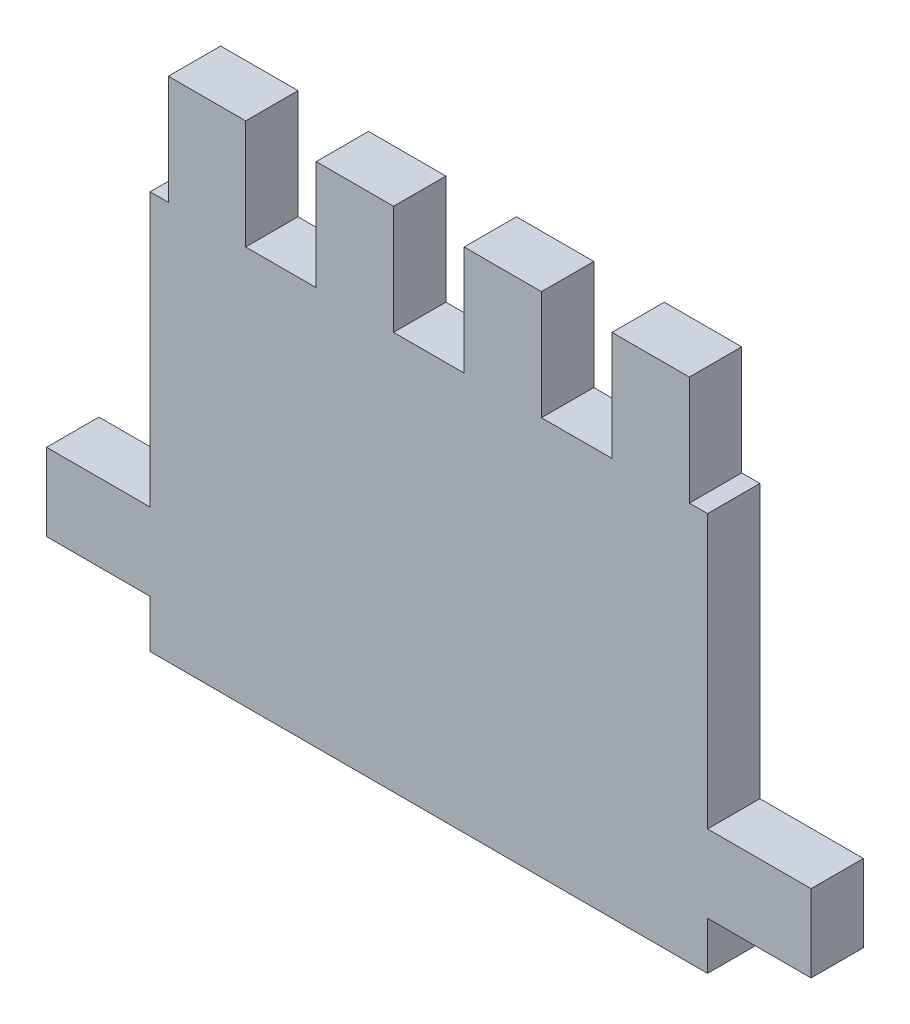
ISO-10303-21;
HEADER;
FILE_DESCRIPTION(('STEP AP214'),'2;1');
FILE_NAME('part.step','',(''),(''),'','','');
FILE_SCHEMA(('AUTOMOTIVE_DESIGN { 1 0 10303 214 1 1 1 1 }'));
ENDSEC;
DATA;
#1=APPLICATION_CONTEXT('core data for automotive mechanical design processes');
#2=APPLICATION_PROTOCOL_DEFINITION('international standard','automotive_design',2000,#1);
#3=PRODUCT_CONTEXT('',#1,'mechanical');
#4=PRODUCT('Part','Part','',(#3));
#5=PRODUCT_RELATED_PRODUCT_CATEGORY('part','',(#4));
#6=PRODUCT_DEFINITION_FORMATION('','',#4);
#7=PRODUCT_DEFINITION_CONTEXT('part definition',#1,'design');
#8=PRODUCT_DEFINITION('design','',#6,#7);
#9=PRODUCT_DEFINITION_SHAPE('','',#8);
#10=(LENGTH_UNIT() NAMED_UNIT(*) SI_UNIT(.MILLI.,.METRE.));
#11=(NAMED_UNIT(*) PLANE_ANGLE_UNIT() SI_UNIT($,.RADIAN.));
#12=(NAMED_UNIT(*) SI_UNIT($,.STERADIAN.) SOLID_ANGLE_UNIT());
#13=UNCERTAINTY_MEASURE_WITH_UNIT(LENGTH_MEASURE(1.E-05),#10,'distance_accuracy_value','');
#14=(GEOMETRIC_REPRESENTATION_CONTEXT(3) GLOBAL_UNCERTAINTY_ASSIGNED_CONTEXT((#13)) GLOBAL_UNIT_ASSIGNED_CONTEXT((#10,
#11,#12)) REPRESENTATION_CONTEXT('',''));
#15=CARTESIAN_POINT('',(0.,0.,0.));
#16=DIRECTION('',(0.,0.,1.));
#17=DIRECTION('',(1.,0.,0.));
#18=AXIS2_PLACEMENT_3D('',#15,#16,#17);
#19=CARTESIAN_POINT('',(47.6788,16.3949,1.93));
#20=DIRECTION('',(1.,0.,0.));
#21=DIRECTION('',(0.,1.,0.));
#22=AXIS2_PLACEMENT_3D('',#19,#20,#21);
#23=PLANE('',#22);
#24=DIRECTION('',(0.,0.,1.));
#25=VECTOR('',#24,1.);
#26=CARTESIAN_POINT('',(47.67880000001,16.05490000001,1.70000000001));
#27=LINE('',#26,#25);
#28=CARTESIAN_POINT('',(47.6788,16.0549,1.7));
#29=VERTEX_POINT('',#28);
#30=CARTESIAN_POINT('',(47.6788,16.0549,1.93));
#31=VERTEX_POINT('',#30);
#32=EDGE_CURVE('E11',#29,#31,#27,.T.);
#33=ORIENTED_EDGE('',*,*,#32,.T.);
#34=DIRECTION('',(0.,1.,0.));
#35=VECTOR('',#34,1.);
#36=CARTESIAN_POINT('',(47.67880000001,16.05490000001,1.93000000001));
#37=LINE('',#36,#35);
#38=CARTESIAN_POINT('',(47.6788,16.3949,1.93));
#39=VERTEX_POINT('',#38);
#40=EDGE_CURVE('E324',#31,#39,#37,.T.);
#41=ORIENTED_EDGE('',*,*,#40,.T.);
#42=DIRECTION('',(0.,0.,1.));
#43=VECTOR('',#42,1.);
#44=CARTESIAN_POINT('',(47.67880000001,16.39490000001,1.70000000001));
#45=LINE('',#44,#43);
#46=CARTESIAN_POINT('',(47.6788,16.3949,1.7));
#47=VERTEX_POINT('',#46);
#48=EDGE_CURVE('E379',#47,#39,#45,.T.);
#49=ORIENTED_EDGE('',*,*,#48,.F.);
#50=DIRECTION('',(0.,1.,0.));
#51=VECTOR('',#50,1.);
#52=CARTESIAN_POINT('',(47.67880000001,16.05490000001,1.70000000001));
#53=LINE('',#52,#51);
#54=EDGE_CURVE('E371',#29,#47,#53,.T.);
#55=ORIENTED_EDGE('',*,*,#54,.F.);
#56=EDGE_LOOP('',(#33,#41,#49,#55));
#57=FACE_BOUND('',#56,.T.);
#58=ADVANCED_FACE('F17',(#57),#23,.F.);
#59=CARTESIAN_POINT('',(48.1338,16.0549,1.93));
#60=DIRECTION('',(0.,1.,0.));
#61=DIRECTION('',(1.,0.,0.));
#62=AXIS2_PLACEMENT_3D('',#59,#60,#61);
#63=PLANE('',#62);
#64=DIRECTION('',(0.,0.,1.));
#65=VECTOR('',#64,1.);
#66=CARTESIAN_POINT('',(48.13380000001,16.05490000001,1.70000000001));
#67=LINE('',#66,#65);
#68=CARTESIAN_POINT('',(48.1338,16.0549,1.7));
#69=VERTEX_POINT('',#68);
#70=CARTESIAN_POINT('',(48.1338,16.0549,1.93));
#71=VERTEX_POINT('',#70);
#72=EDGE_CURVE('E21',#69,#71,#67,.T.);
#73=ORIENTED_EDGE('',*,*,#72,.T.);
#74=DIRECTION('',(-1.,0.,0.));
#75=VECTOR('',#74,1.);
#76=CARTESIAN_POINT('',(48.13380000001,16.05490000001,1.93000000001));
#77=LINE('',#76,#75);
#78=EDGE_CURVE('E327',#71,#31,#77,.T.);
#79=ORIENTED_EDGE('',*,*,#78,.T.);
#80=ORIENTED_EDGE('',*,*,#32,.F.);
#81=DIRECTION('',(-1.,0.,0.));
#82=VECTOR('',#81,1.);
#83=CARTESIAN_POINT('',(48.13380000001,16.05490000001,1.70000000001));
#84=LINE('',#83,#82);
#85=EDGE_CURVE('E376',#69,#29,#84,.T.);
#86=ORIENTED_EDGE('',*,*,#85,.F.);
#87=EDGE_LOOP('',(#73,#79,#80,#86));
#88=FACE_BOUND('',#87,.T.);
#89=ADVANCED_FACE('F485',(#88),#63,.F.);
#90=CARTESIAN_POINT('',(48.1338,16.0549,1.93));
#91=DIRECTION('',(1.,0.,0.));
#92=DIRECTION('',(0.,1.,0.));
#93=AXIS2_PLACEMENT_3D('',#90,#91,#92);
#94=PLANE('',#93);
#95=DIRECTION('',(0.,0.,1.));
#96=VECTOR('',#95,1.);
#97=CARTESIAN_POINT('',(48.13380000001,15.84490000001,1.70000000001));
#98=LINE('',#97,#96);
#99=CARTESIAN_POINT('',(48.1338,15.8449,1.7));
#100=VERTEX_POINT('',#99);
#101=CARTESIAN_POINT('',(48.1338,15.8449,1.93));
#102=VERTEX_POINT('',#101);
#103=EDGE_CURVE('E317',#100,#102,#98,.T.);
#104=ORIENTED_EDGE('',*,*,#103,.T.);
#105=DIRECTION('',(0.,1.,0.));
#106=VECTOR('',#105,1.);
#107=CARTESIAN_POINT('',(48.13380000001,15.84490000001,1.93000000001));
#108=LINE('',#107,#106);
#109=EDGE_CURVE('E389',#102,#71,#108,.T.);
#110=ORIENTED_EDGE('',*,*,#109,.T.);
#111=ORIENTED_EDGE('',*,*,#72,.F.);
#112=DIRECTION('',(0.,1.,0.));
#113=VECTOR('',#112,1.);
#114=CARTESIAN_POINT('',(48.13380000001,15.84490000001,1.70000000001));
#115=LINE('',#114,#113);
#116=EDGE_CURVE('E370',#100,#69,#115,.T.);
#117=ORIENTED_EDGE('',*,*,#116,.F.);
#118=EDGE_LOOP('',(#104,#110,#111,#117));
#119=FACE_BOUND('',#118,.T.);
#120=ADVANCED_FACE('F19',(#119),#94,.F.);
#121=CARTESIAN_POINT('',(50.5838,15.8449,1.93));
#122=DIRECTION('',(0.,1.,0.));
#123=DIRECTION('',(1.,0.,0.));
#124=AXIS2_PLACEMENT_3D('',#121,#122,#123);
#125=PLANE('',#124);
#126=DIRECTION('',(0.,0.,1.));
#127=VECTOR('',#126,1.);
#128=CARTESIAN_POINT('',(50.58380000001,15.84490000001,1.70000000001));
#129=LINE('',#128,#127);
#130=CARTESIAN_POINT('',(50.5838,15.8449,1.7));
#131=VERTEX_POINT('',#130);
#132=CARTESIAN_POINT('',(50.5838,15.8449,1.93));
#133=VERTEX_POINT('',#132);
#134=EDGE_CURVE('E314',#131,#133,#129,.T.);
#135=ORIENTED_EDGE('',*,*,#134,.T.);
#136=DIRECTION('',(-1.,0.,0.));
#137=VECTOR('',#136,1.);
#138=CARTESIAN_POINT('',(50.58380000001,15.84490000001,1.93000000001));
#139=LINE('',#138,#137);
#140=EDGE_CURVE('E345',#133,#102,#139,.T.);
#141=ORIENTED_EDGE('',*,*,#140,.T.);
#142=ORIENTED_EDGE('',*,*,#103,.F.);
#143=DIRECTION('',(-1.,0.,0.));
#144=VECTOR('',#143,1.);
#145=CARTESIAN_POINT('',(50.58380000001,15.84490000001,1.70000000001));
#146=LINE('',#145,#144);
#147=EDGE_CURVE('E361',#131,#100,#146,.T.);
#148=ORIENTED_EDGE('',*,*,#147,.F.);
#149=EDGE_LOOP('',(#135,#141,#142,#148));
#150=FACE_BOUND('',#149,.T.);
#151=ADVANCED_FACE('F1167',(#150),#125,.F.);
#152=CARTESIAN_POINT('',(50.5838,16.0549,1.93));
#153=DIRECTION('',(-1.,0.,0.));
#154=DIRECTION('',(0.,0.,1.));
#155=AXIS2_PLACEMENT_3D('',#152,#153,#154);
#156=PLANE('',#155);
#157=DIRECTION('',(0.,0.,1.));
#158=VECTOR('',#157,1.);
#159=CARTESIAN_POINT('',(50.58380000001,16.05490000001,1.70000000001));
#160=LINE('',#159,#158);
#161=CARTESIAN_POINT('',(50.5838,16.0549,1.7));
#162=VERTEX_POINT('',#161);
#163=CARTESIAN_POINT('',(50.5838,16.0549,1.93));
#164=VERTEX_POINT('',#163);
#165=EDGE_CURVE('E318',#162,#164,#160,.T.);
#166=ORIENTED_EDGE('',*,*,#165,.T.);
#167=DIRECTION('',(0.,-1.,0.));
#168=VECTOR('',#167,1.);
#169=CARTESIAN_POINT('',(50.58380000001,16.05490000001,1.93000000001));
#170=LINE('',#169,#168);
#171=EDGE_CURVE('E340',#164,#133,#170,.T.);
#172=ORIENTED_EDGE('',*,*,#171,.T.);
#173=ORIENTED_EDGE('',*,*,#134,.F.);
#174=DIRECTION('',(0.,-1.,0.));
#175=VECTOR('',#174,1.);
#176=CARTESIAN_POINT('',(50.58380000001,16.05490000001,1.70000000001));
#177=LINE('',#176,#175);
#178=EDGE_CURVE('E357',#162,#131,#177,.T.);
#179=ORIENTED_EDGE('',*,*,#178,.F.);
#180=EDGE_LOOP('',(#166,#172,#173,#179));
#181=FACE_BOUND('',#180,.T.);
#182=ADVANCED_FACE('F724',(#181),#156,.F.);
#183=CARTESIAN_POINT('',(50.5838,16.0549,1.93));
#184=DIRECTION('',(0.,1.,0.));
#185=DIRECTION('',(1.,0.,0.));
#186=AXIS2_PLACEMENT_3D('',#183,#184,#185);
#187=PLANE('',#186);
#188=DIRECTION('',(0.,0.,1.));
#189=VECTOR('',#188,1.);
#190=CARTESIAN_POINT('',(51.03880000001,16.05490000001,1.70000000001));
#191=LINE('',#190,#189);
#192=CARTESIAN_POINT('',(51.0388,16.0549,1.7));
#193=VERTEX_POINT('',#192);
#194=CARTESIAN_POINT('',(51.0388,16.0549,1.93));
#195=VERTEX_POINT('',#194);
#196=EDGE_CURVE('E332',#193,#195,#191,.T.);
#197=ORIENTED_EDGE('',*,*,#196,.T.);
#198=DIRECTION('',(-1.,0.,0.));
#199=VECTOR('',#198,1.);
#200=CARTESIAN_POINT('',(51.03880000001,16.05490000001,1.93000000001));
#201=LINE('',#200,#199);
#202=EDGE_CURVE('E344',#195,#164,#201,.T.);
#203=ORIENTED_EDGE('',*,*,#202,.T.);
#204=ORIENTED_EDGE('',*,*,#165,.F.);
#205=DIRECTION('',(-1.,0.,0.));
#206=VECTOR('',#205,1.);
#207=CARTESIAN_POINT('',(51.03880000001,16.05490000001,1.70000000001));
#208=LINE('',#207,#206);
#209=EDGE_CURVE('E353',#193,#162,#208,.T.);
#210=ORIENTED_EDGE('',*,*,#209,.F.);
#211=EDGE_LOOP('',(#197,#203,#204,#210));
#212=FACE_BOUND('',#211,.T.);
#213=ADVANCED_FACE('F715',(#212),#187,.F.);
#214=CARTESIAN_POINT('',(51.0388,16.3949,1.93));
#215=DIRECTION('',(-1.,0.,0.));
#216=DIRECTION('',(0.,0.,1.));
#217=AXIS2_PLACEMENT_3D('',#214,#215,#216);
#218=PLANE('',#217);
#219=DIRECTION('',(0.,0.,1.));
#220=VECTOR('',#219,1.);
#221=CARTESIAN_POINT('',(51.03880000001,16.39490000001,1.70000000001));
#222=LINE('',#221,#220);
#223=CARTESIAN_POINT('',(51.0388,16.3949,1.7));
#224=VERTEX_POINT('',#223);
#225=CARTESIAN_POINT('',(51.0388,16.3949,1.93));
#226=VERTEX_POINT('',#225);
#227=EDGE_CURVE('E335',#224,#226,#222,.T.);
#228=ORIENTED_EDGE('',*,*,#227,.T.);
#229=DIRECTION('',(0.,-1.,0.));
#230=VECTOR('',#229,1.);
#231=CARTESIAN_POINT('',(51.03880000001,16.39490000001,1.93000000001));
#232=LINE('',#231,#230);
#233=EDGE_CURVE('E396',#226,#195,#232,.T.);
#234=ORIENTED_EDGE('',*,*,#233,.T.);
#235=ORIENTED_EDGE('',*,*,#196,.F.);
#236=DIRECTION('',(0.,-1.,0.));
#237=VECTOR('',#236,1.);
#238=CARTESIAN_POINT('',(51.03880000001,16.39490000001,1.70000000001));
#239=LINE('',#238,#237);
#240=EDGE_CURVE('E349',#224,#193,#239,.T.);
#241=ORIENTED_EDGE('',*,*,#240,.F.);
#242=EDGE_LOOP('',(#228,#234,#235,#241));
#243=FACE_BOUND('',#242,.T.);
#244=ADVANCED_FACE('F712',(#243),#218,.F.);
#245=CARTESIAN_POINT('',(50.5838,16.3949,1.93));
#246=DIRECTION('',(0.,-1.,0.));
#247=DIRECTION('',(0.,0.,-1.));
#248=AXIS2_PLACEMENT_3D('',#245,#246,#247);
#249=PLANE('',#248);
#250=DIRECTION('',(0.,0.,1.));
#251=VECTOR('',#250,1.);
#252=CARTESIAN_POINT('',(50.58380000001,16.39490000001,1.70000000001));
#253=LINE('',#252,#251);
#254=CARTESIAN_POINT('',(50.5838,16.3949,1.7));
#255=VERTEX_POINT('',#254);
#256=CARTESIAN_POINT('',(50.5838,16.3949,1.93));
#257=VERTEX_POINT('',#256);
#258=EDGE_CURVE('E385',#255,#257,#253,.T.);
#259=ORIENTED_EDGE('',*,*,#258,.T.);
#260=DIRECTION('',(1.,0.,0.));
#261=VECTOR('',#260,1.);
#262=CARTESIAN_POINT('',(50.58380000001,16.39490000001,1.93000000001));
#263=LINE('',#262,#261);
#264=EDGE_CURVE('E397',#257,#226,#263,.T.);
#265=ORIENTED_EDGE('',*,*,#264,.T.);
#266=ORIENTED_EDGE('',*,*,#227,.F.);
#267=DIRECTION('',(1.,0.,0.));
#268=VECTOR('',#267,1.);
#269=CARTESIAN_POINT('',(50.58380000001,16.39490000001,1.70000000001));
#270=LINE('',#269,#268);
#271=EDGE_CURVE('E339',#255,#224,#270,.T.);
#272=ORIENTED_EDGE('',*,*,#271,.F.);
#273=EDGE_LOOP('',(#259,#265,#266,#272));
#274=FACE_BOUND('',#273,.T.);
#275=ADVANCED_FACE('F714',(#274),#249,.F.);
#276=CARTESIAN_POINT('',(50.5838,17.5949,1.93));
#277=DIRECTION('',(-1.,0.,0.));
#278=DIRECTION('',(0.,0.,1.));
#279=AXIS2_PLACEMENT_3D('',#276,#277,#278);
#280=PLANE('',#279);
#281=DIRECTION('',(0.,0.,1.));
#282=VECTOR('',#281,1.);
#283=CARTESIAN_POINT('',(50.58380000001,17.59490000001,1.70000000001));
#284=LINE('',#283,#282);
#285=CARTESIAN_POINT('',(50.5838,17.5949,1.7));
#286=VERTEX_POINT('',#285);
#287=CARTESIAN_POINT('',(50.5838,17.5949,1.93));
#288=VERTEX_POINT('',#287);
#289=EDGE_CURVE('E472',#286,#288,#284,.T.);
#290=ORIENTED_EDGE('',*,*,#289,.T.);
#291=DIRECTION('',(0.,-1.,0.));
#292=VECTOR('',#291,1.);
#293=CARTESIAN_POINT('',(50.58380000001,17.59490000001,1.93000000001));
#294=LINE('',#293,#292);
#295=EDGE_CURVE('E401',#288,#257,#294,.T.);
#296=ORIENTED_EDGE('',*,*,#295,.T.);
#297=ORIENTED_EDGE('',*,*,#258,.F.);
#298=DIRECTION('',(0.,-1.,0.));
#299=VECTOR('',#298,1.);
#300=CARTESIAN_POINT('',(50.58380000001,17.59490000001,1.70000000001));
#301=LINE('',#300,#299);
#302=EDGE_CURVE('E331',#286,#255,#301,.T.);
#303=ORIENTED_EDGE('',*,*,#302,.F.);
#304=EDGE_LOOP('',(#290,#296,#297,#303));
#305=FACE_BOUND('',#304,.T.);
#306=ADVANCED_FACE('F707',(#305),#280,.F.);
#307=CARTESIAN_POINT('',(50.5038,17.5949,1.93));
#308=DIRECTION('',(0.,-1.,0.));
#309=DIRECTION('',(0.,0.,-1.));
#310=AXIS2_PLACEMENT_3D('',#307,#308,#309);
#311=PLANE('',#310);
#312=DIRECTION('',(0.,0.,1.));
#313=VECTOR('',#312,1.);
#314=CARTESIAN_POINT('',(50.50380000001,17.59490000001,1.70000000001));
#315=LINE('',#314,#313);
#316=CARTESIAN_POINT('',(50.5038,17.5949,1.7));
#317=VERTEX_POINT('',#316);
#318=CARTESIAN_POINT('',(50.5038,17.5949,1.93));
#319=VERTEX_POINT('',#318);
#320=EDGE_CURVE('E288',#317,#319,#315,.T.);
#321=ORIENTED_EDGE('',*,*,#320,.T.);
#322=DIRECTION('',(1.,0.,0.));
#323=VECTOR('',#322,1.);
#324=CARTESIAN_POINT('',(50.50380000001,17.59490000001,1.93000000001));
#325=LINE('',#324,#323);
#326=EDGE_CURVE('E405',#319,#288,#325,.T.);
#327=ORIENTED_EDGE('',*,*,#326,.T.);
#328=ORIENTED_EDGE('',*,*,#289,.F.);
#329=DIRECTION('',(1.,0.,0.));
#330=VECTOR('',#329,1.);
#331=CARTESIAN_POINT('',(50.50380000001,17.59490000001,1.70000000001));
#332=LINE('',#331,#330);
#333=EDGE_CURVE('E297',#317,#286,#332,.T.);
#334=ORIENTED_EDGE('',*,*,#333,.F.);
#335=EDGE_LOOP('',(#321,#327,#328,#334));
#336=FACE_BOUND('',#335,.T.);
#337=ADVANCED_FACE('F704',(#336),#311,.F.);
#338=CARTESIAN_POINT('',(50.5038,17.5949,1.93));
#339=DIRECTION('',(-1.,0.,0.));
#340=DIRECTION('',(0.,0.,1.));
#341=AXIS2_PLACEMENT_3D('',#338,#339,#340);
#342=PLANE('',#341);
#343=DIRECTION('',(0.,0.,1.));
#344=VECTOR('',#343,1.);
#345=CARTESIAN_POINT('',(50.50380000001,18.07490000001,1.70000000001));
#346=LINE('',#345,#344);
#347=CARTESIAN_POINT('',(50.5038,18.0749,1.7));
#348=VERTEX_POINT('',#347);
#349=CARTESIAN_POINT('',(50.5038,18.0749,1.93));
#350=VERTEX_POINT('',#349);
#351=EDGE_CURVE('E276',#348,#350,#346,.T.);
#352=ORIENTED_EDGE('',*,*,#351,.T.);
#353=DIRECTION('',(0.,-1.,0.));
#354=VECTOR('',#353,1.);
#355=CARTESIAN_POINT('',(50.50380000001,18.07490000001,1.93000000001));
#356=LINE('',#355,#354);
#357=EDGE_CURVE('E409',#350,#319,#356,.T.);
#358=ORIENTED_EDGE('',*,*,#357,.T.);
#359=ORIENTED_EDGE('',*,*,#320,.F.);
#360=DIRECTION('',(0.,-1.,0.));
#361=VECTOR('',#360,1.);
#362=CARTESIAN_POINT('',(50.50380000001,18.07490000001,1.70000000001));
#363=LINE('',#362,#361);
#364=EDGE_CURVE('E291',#348,#317,#363,.T.);
#365=ORIENTED_EDGE('',*,*,#364,.F.);
#366=EDGE_LOOP('',(#352,#358,#359,#365));
#367=FACE_BOUND('',#366,.T.);
#368=ADVANCED_FACE('F292',(#367),#342,.F.);
#369=CARTESIAN_POINT('',(50.1638,18.0749,1.93));
#370=DIRECTION('',(0.,-1.,0.));
#371=DIRECTION('',(0.,0.,-1.));
#372=AXIS2_PLACEMENT_3D('',#369,#370,#371);
#373=PLANE('',#372);
#374=DIRECTION('',(0.,0.,1.));
#375=VECTOR('',#374,1.);
#376=CARTESIAN_POINT('',(50.16380000001,18.07490000001,1.70000000001));
#377=LINE('',#376,#375);
#378=CARTESIAN_POINT('',(50.1638,18.0749,1.7));
#379=VERTEX_POINT('',#378);
#380=CARTESIAN_POINT('',(50.1638,18.0749,1.93));
#381=VERTEX_POINT('',#380);
#382=EDGE_CURVE('E270',#379,#381,#377,.T.);
#383=ORIENTED_EDGE('',*,*,#382,.T.);
#384=DIRECTION('',(1.,0.,0.));
#385=VECTOR('',#384,1.);
#386=CARTESIAN_POINT('',(50.16380000001,18.07490000001,1.93000000001));
#387=LINE('',#386,#385);
#388=EDGE_CURVE('E283',#381,#350,#387,.T.);
#389=ORIENTED_EDGE('',*,*,#388,.T.);
#390=ORIENTED_EDGE('',*,*,#351,.F.);
#391=DIRECTION('',(1.,0.,0.));
#392=VECTOR('',#391,1.);
#393=CARTESIAN_POINT('',(50.16380000001,18.07490000001,1.70000000001));
#394=LINE('',#393,#392);
#395=EDGE_CURVE('E280',#379,#348,#394,.T.);
#396=ORIENTED_EDGE('',*,*,#395,.F.);
#397=EDGE_LOOP('',(#383,#389,#390,#396));
#398=FACE_BOUND('',#397,.T.);
#399=ADVANCED_FACE('F278',(#398),#373,.F.);
#400=CARTESIAN_POINT('',(50.1638,17.5949,1.93));
#401=DIRECTION('',(1.,0.,0.));
#402=DIRECTION('',(0.,1.,0.));
#403=AXIS2_PLACEMENT_3D('',#400,#401,#402);
#404=PLANE('',#403);
#405=DIRECTION('',(0.,0.,1.));
#406=VECTOR('',#405,1.);
#407=CARTESIAN_POINT('',(50.16380000001,17.59490000001,1.70000000001));
#408=LINE('',#407,#406);
#409=CARTESIAN_POINT('',(50.1638,17.5949,1.7));
#410=VERTEX_POINT('',#409);
#411=CARTESIAN_POINT('',(50.1638,17.5949,1.93));
#412=VERTEX_POINT('',#411);
#413=EDGE_CURVE('E468',#410,#412,#408,.T.);
#414=ORIENTED_EDGE('',*,*,#413,.T.);
#415=DIRECTION('',(0.,1.,0.));
#416=VECTOR('',#415,1.);
#417=CARTESIAN_POINT('',(50.16380000001,17.59490000001,1.93000000001));
#418=LINE('',#417,#416);
#419=EDGE_CURVE('E312',#412,#381,#418,.T.);
#420=ORIENTED_EDGE('',*,*,#419,.T.);
#421=ORIENTED_EDGE('',*,*,#382,.F.);
#422=DIRECTION('',(0.,1.,0.));
#423=VECTOR('',#422,1.);
#424=CARTESIAN_POINT('',(50.16380000001,17.59490000001,1.70000000001));
#425=LINE('',#424,#423);
#426=EDGE_CURVE('E302',#410,#379,#425,.T.);
#427=ORIENTED_EDGE('',*,*,#426,.F.);
#428=EDGE_LOOP('',(#414,#420,#421,#427));
#429=FACE_BOUND('',#428,.T.);
#430=ADVANCED_FACE('F673',(#429),#404,.F.);
#431=CARTESIAN_POINT('',(50.1638,17.5949,1.93));
#432=DIRECTION('',(0.,-1.,0.));
#433=DIRECTION('',(0.,0.,-1.));
#434=AXIS2_PLACEMENT_3D('',#431,#432,#433);
#435=PLANE('',#434);
#436=DIRECTION('',(0.,0.,1.));
#437=VECTOR('',#436,1.);
#438=CARTESIAN_POINT('',(49.85380000001,17.59490000001,1.70000000001));
#439=LINE('',#438,#437);
#440=CARTESIAN_POINT('',(49.8538,17.5949,1.7));
#441=VERTEX_POINT('',#440);
#442=CARTESIAN_POINT('',(49.8538,17.5949,1.93));
#443=VERTEX_POINT('',#442);
#444=EDGE_CURVE('E466',#441,#443,#439,.T.);
#445=ORIENTED_EDGE('',*,*,#444,.T.);
#446=DIRECTION('',(1.,0.,0.));
#447=VECTOR('',#446,1.);
#448=CARTESIAN_POINT('',(49.85380000001,17.59490000001,1.93000000001));
#449=LINE('',#448,#447);
#450=EDGE_CURVE('E319',#443,#412,#449,.T.);
#451=ORIENTED_EDGE('',*,*,#450,.T.);
#452=ORIENTED_EDGE('',*,*,#413,.F.);
#453=DIRECTION('',(1.,0.,0.));
#454=VECTOR('',#453,1.);
#455=CARTESIAN_POINT('',(49.85380000001,17.59490000001,1.70000000001));
#456=LINE('',#455,#454);
#457=EDGE_CURVE('E309',#441,#410,#456,.T.);
#458=ORIENTED_EDGE('',*,*,#457,.F.);
#459=EDGE_LOOP('',(#445,#451,#452,#458));
#460=FACE_BOUND('',#459,.T.);
#461=ADVANCED_FACE('F671',(#460),#435,.F.);
#462=CARTESIAN_POINT('',(49.8538,17.5949,1.93));
#463=DIRECTION('',(-1.,0.,0.));
#464=DIRECTION('',(0.,0.,1.));
#465=AXIS2_PLACEMENT_3D('',#462,#463,#464);
#466=PLANE('',#465);
#467=DIRECTION('',(0.,0.,1.));
#468=VECTOR('',#467,1.);
#469=CARTESIAN_POINT('',(49.85380000001,18.07490000001,1.70000000001));
#470=LINE('',#469,#468);
#471=CARTESIAN_POINT('',(49.8538,18.0749,1.7));
#472=VERTEX_POINT('',#471);
#473=CARTESIAN_POINT('',(49.8538,18.0749,1.93));
#474=VERTEX_POINT('',#473);
#475=EDGE_CURVE('E463',#472,#474,#470,.T.);
#476=ORIENTED_EDGE('',*,*,#475,.T.);
#477=DIRECTION('',(0.,-1.,0.));
#478=VECTOR('',#477,1.);
#479=CARTESIAN_POINT('',(49.85380000001,18.07490000001,1.93000000001));
#480=LINE('',#479,#478);
#481=EDGE_CURVE('E323',#474,#443,#480,.T.);
#482=ORIENTED_EDGE('',*,*,#481,.T.);
#483=ORIENTED_EDGE('',*,*,#444,.F.);
#484=DIRECTION('',(0.,-1.,0.));
#485=VECTOR('',#484,1.);
#486=CARTESIAN_POINT('',(49.85380000001,18.07490000001,1.70000000001));
#487=LINE('',#486,#485);
#488=EDGE_CURVE('E511',#472,#441,#487,.T.);
#489=ORIENTED_EDGE('',*,*,#488,.F.);
#490=EDGE_LOOP('',(#476,#482,#483,#489));
#491=FACE_BOUND('',#490,.T.);
#492=ADVANCED_FACE('F668',(#491),#466,.F.);
#493=CARTESIAN_POINT('',(49.5138,18.0749,1.93));
#494=DIRECTION('',(0.,-1.,0.));
#495=DIRECTION('',(0.,0.,-1.));
#496=AXIS2_PLACEMENT_3D('',#493,#494,#495);
#497=PLANE('',#496);
#498=DIRECTION('',(0.,0.,1.));
#499=VECTOR('',#498,1.);
#500=CARTESIAN_POINT('',(49.51380000001,18.07490000001,1.70000000001));
#501=LINE('',#500,#499);
#502=CARTESIAN_POINT('',(49.5138,18.0749,1.7));
#503=VERTEX_POINT('',#502);
#504=CARTESIAN_POINT('',(49.5138,18.0749,1.93));
#505=VERTEX_POINT('',#504);
#506=EDGE_CURVE('E462',#503,#505,#501,.T.);
#507=ORIENTED_EDGE('',*,*,#506,.T.);
#508=DIRECTION('',(1.,0.,0.));
#509=VECTOR('',#508,1.);
#510=CARTESIAN_POINT('',(49.51380000001,18.07490000001,1.93000000001));
#511=LINE('',#510,#509);
#512=EDGE_CURVE('E417',#505,#474,#511,.T.);
#513=ORIENTED_EDGE('',*,*,#512,.T.);
#514=ORIENTED_EDGE('',*,*,#475,.F.);
#515=DIRECTION('',(1.,0.,0.));
#516=VECTOR('',#515,1.);
#517=CARTESIAN_POINT('',(49.51380000001,18.07490000001,1.70000000001));
#518=LINE('',#517,#516);
#519=EDGE_CURVE('E517',#503,#472,#518,.T.);
#520=ORIENTED_EDGE('',*,*,#519,.F.);
#521=EDGE_LOOP('',(#507,#513,#514,#520));
#522=FACE_BOUND('',#521,.T.);
#523=ADVANCED_FACE('F665',(#522),#497,.F.);
#524=CARTESIAN_POINT('',(49.5138,17.5949,1.93));
#525=DIRECTION('',(1.,0.,0.));
#526=DIRECTION('',(0.,1.,0.));
#527=AXIS2_PLACEMENT_3D('',#524,#525,#526);
#528=PLANE('',#527);
#529=DIRECTION('',(0.,0.,1.));
#530=VECTOR('',#529,1.);
#531=CARTESIAN_POINT('',(49.51380000001,17.59490000001,1.70000000001));
#532=LINE('',#531,#530);
#533=CARTESIAN_POINT('',(49.5138,17.5949,1.7));
#534=VERTEX_POINT('',#533);
#535=CARTESIAN_POINT('',(49.5138,17.5949,1.93));
#536=VERTEX_POINT('',#535);
#537=EDGE_CURVE('E457',#534,#536,#532,.T.);
#538=ORIENTED_EDGE('',*,*,#537,.T.);
#539=DIRECTION('',(0.,1.,0.));
#540=VECTOR('',#539,1.);
#541=CARTESIAN_POINT('',(49.51380000001,17.59490000001,1.93000000001));
#542=LINE('',#541,#540);
#543=EDGE_CURVE('E418',#536,#505,#542,.T.);
#544=ORIENTED_EDGE('',*,*,#543,.T.);
#545=ORIENTED_EDGE('',*,*,#506,.F.);
#546=DIRECTION('',(0.,1.,0.));
#547=VECTOR('',#546,1.);
#548=CARTESIAN_POINT('',(49.51380000001,17.59490000001,1.70000000001));
#549=LINE('',#548,#547);
#550=EDGE_CURVE('E524',#534,#503,#549,.T.);
#551=ORIENTED_EDGE('',*,*,#550,.F.);
#552=EDGE_LOOP('',(#538,#544,#545,#551));
#553=FACE_BOUND('',#552,.T.);
#554=ADVANCED_FACE('F660',(#553),#528,.F.);
#555=CARTESIAN_POINT('',(49.5138,17.5949,1.93));
#556=DIRECTION('',(0.,-1.,0.));
#557=DIRECTION('',(0.,0.,-1.));
#558=AXIS2_PLACEMENT_3D('',#555,#556,#557);
#559=PLANE('',#558);
#560=DIRECTION('',(0.,0.,1.));
#561=VECTOR('',#560,1.);
#562=CARTESIAN_POINT('',(49.20380000001,17.59490000001,1.70000000001));
#563=LINE('',#562,#561);
#564=CARTESIAN_POINT('',(49.2038,17.5949,1.7));
#565=VERTEX_POINT('',#564);
#566=CARTESIAN_POINT('',(49.2038,17.5949,1.93));
#567=VERTEX_POINT('',#566);
#568=EDGE_CURVE('E454',#565,#567,#563,.T.);
#569=ORIENTED_EDGE('',*,*,#568,.T.);
#570=DIRECTION('',(1.,0.,0.));
#571=VECTOR('',#570,1.);
#572=CARTESIAN_POINT('',(49.20380000001,17.59490000001,1.93000000001));
#573=LINE('',#572,#571);
#574=EDGE_CURVE('E422',#567,#536,#573,.T.);
#575=ORIENTED_EDGE('',*,*,#574,.T.);
#576=ORIENTED_EDGE('',*,*,#537,.F.);
#577=DIRECTION('',(1.,0.,0.));
#578=VECTOR('',#577,1.);
#579=CARTESIAN_POINT('',(49.20380000001,17.59490000001,1.70000000001));
#580=LINE('',#579,#578);
#581=EDGE_CURVE('E551',#565,#534,#580,.T.);
#582=ORIENTED_EDGE('',*,*,#581,.F.);
#583=EDGE_LOOP('',(#569,#575,#576,#582));
#584=FACE_BOUND('',#583,.T.);
#585=ADVANCED_FACE('F657',(#584),#559,.F.);
#586=CARTESIAN_POINT('',(49.2038,17.5949,1.93));
#587=DIRECTION('',(-1.,0.,0.));
#588=DIRECTION('',(0.,0.,1.));
#589=AXIS2_PLACEMENT_3D('',#586,#587,#588);
#590=PLANE('',#589);
#591=DIRECTION('',(0.,0.,1.));
#592=VECTOR('',#591,1.);
#593=CARTESIAN_POINT('',(49.20380000001,18.07490000001,1.70000000001));
#594=LINE('',#593,#592);
#595=CARTESIAN_POINT('',(49.2038,18.0749,1.7));
#596=VERTEX_POINT('',#595);
#597=CARTESIAN_POINT('',(49.2038,18.0749,1.93));
#598=VERTEX_POINT('',#597);
#599=EDGE_CURVE('E453',#596,#598,#594,.T.);
#600=ORIENTED_EDGE('',*,*,#599,.T.);
#601=DIRECTION('',(0.,-1.,0.));
#602=VECTOR('',#601,1.);
#603=CARTESIAN_POINT('',(49.20380000001,18.07490000001,1.93000000001));
#604=LINE('',#603,#602);
#605=EDGE_CURVE('E426',#598,#567,#604,.T.);
#606=ORIENTED_EDGE('',*,*,#605,.T.);
#607=ORIENTED_EDGE('',*,*,#568,.F.);
#608=DIRECTION('',(0.,-1.,0.));
#609=VECTOR('',#608,1.);
#610=CARTESIAN_POINT('',(49.20380000001,18.07490000001,1.70000000001));
#611=LINE('',#610,#609);
#612=EDGE_CURVE('E547',#596,#565,#611,.T.);
#613=ORIENTED_EDGE('',*,*,#612,.F.);
#614=EDGE_LOOP('',(#600,#606,#607,#613));
#615=FACE_BOUND('',#614,.T.);
#616=ADVANCED_FACE('F654',(#615),#590,.F.);
#617=CARTESIAN_POINT('',(48.8638,18.0749,1.93));
#618=DIRECTION('',(0.,-1.,0.));
#619=DIRECTION('',(0.,0.,-1.));
#620=AXIS2_PLACEMENT_3D('',#617,#618,#619);
#621=PLANE('',#620);
#622=DIRECTION('',(0.,0.,1.));
#623=VECTOR('',#622,1.);
#624=CARTESIAN_POINT('',(48.86380000001,18.07490000001,1.70000000001));
#625=LINE('',#624,#623);
#626=CARTESIAN_POINT('',(48.8638,18.0749,1.7));
#627=VERTEX_POINT('',#626);
#628=CARTESIAN_POINT('',(48.8638,18.0749,1.93));
#629=VERTEX_POINT('',#628);
#630=EDGE_CURVE('E450',#627,#629,#625,.T.);
#631=ORIENTED_EDGE('',*,*,#630,.T.);
#632=DIRECTION('',(1.,0.,0.));
#633=VECTOR('',#632,1.);
#634=CARTESIAN_POINT('',(48.86380000001,18.07490000001,1.93000000001));
#635=LINE('',#634,#633);
#636=EDGE_CURVE('E427',#629,#598,#635,.T.);
#637=ORIENTED_EDGE('',*,*,#636,.T.);
#638=ORIENTED_EDGE('',*,*,#599,.F.);
#639=DIRECTION('',(1.,0.,0.));
#640=VECTOR('',#639,1.);
#641=CARTESIAN_POINT('',(48.86380000001,18.07490000001,1.70000000001));
#642=LINE('',#641,#640);
#643=EDGE_CURVE('E552',#627,#596,#642,.T.);
#644=ORIENTED_EDGE('',*,*,#643,.F.);
#645=EDGE_LOOP('',(#631,#637,#638,#644));
#646=FACE_BOUND('',#645,.T.);
#647=ADVANCED_FACE('F650',(#646),#621,.F.);
#648=CARTESIAN_POINT('',(48.8638,17.5949,1.93));
#649=DIRECTION('',(1.,0.,0.));
#650=DIRECTION('',(0.,1.,0.));
#651=AXIS2_PLACEMENT_3D('',#648,#649,#650);
#652=PLANE('',#651);
#653=DIRECTION('',(0.,0.,1.));
#654=VECTOR('',#653,1.);
#655=CARTESIAN_POINT('',(48.86380000001,17.59490000001,1.70000000001));
#656=LINE('',#655,#654);
#657=CARTESIAN_POINT('',(48.8638,17.5949,1.7));
#658=VERTEX_POINT('',#657);
#659=CARTESIAN_POINT('',(48.8638,17.5949,1.93));
#660=VERTEX_POINT('',#659);
#661=EDGE_CURVE('E447',#658,#660,#656,.T.);
#662=ORIENTED_EDGE('',*,*,#661,.T.);
#663=DIRECTION('',(0.,1.,0.));
#664=VECTOR('',#663,1.);
#665=CARTESIAN_POINT('',(48.86380000001,17.59490000001,1.93000000001));
#666=LINE('',#665,#664);
#667=EDGE_CURVE('E366',#660,#629,#666,.T.);
#668=ORIENTED_EDGE('',*,*,#667,.T.);
#669=ORIENTED_EDGE('',*,*,#630,.F.);
#670=DIRECTION('',(0.,1.,0.));
#671=VECTOR('',#670,1.);
#672=CARTESIAN_POINT('',(48.86380000001,17.59490000001,1.70000000001));
#673=LINE('',#672,#671);
#674=EDGE_CURVE('E545',#658,#627,#673,.T.);
#675=ORIENTED_EDGE('',*,*,#674,.F.);
#676=EDGE_LOOP('',(#662,#668,#669,#675));
#677=FACE_BOUND('',#676,.T.);
#678=ADVANCED_FACE('F647',(#677),#652,.F.);
#679=CARTESIAN_POINT('',(48.8638,17.5949,1.93));
#680=DIRECTION('',(0.,-1.,0.));
#681=DIRECTION('',(0.,0.,-1.));
#682=AXIS2_PLACEMENT_3D('',#679,#680,#681);
#683=PLANE('',#682);
#684=DIRECTION('',(0.,0.,1.));
#685=VECTOR('',#684,1.);
#686=CARTESIAN_POINT('',(48.55380000001,17.59490000001,1.70000000001));
#687=LINE('',#686,#685);
#688=CARTESIAN_POINT('',(48.5538,17.5949,1.7));
#689=VERTEX_POINT('',#688);
#690=CARTESIAN_POINT('',(48.5538,17.5949,1.93));
#691=VERTEX_POINT('',#690);
#692=EDGE_CURVE('E180',#689,#691,#687,.T.);
#693=ORIENTED_EDGE('',*,*,#692,.T.);
#694=DIRECTION('',(1.,0.,0.));
#695=VECTOR('',#694,1.);
#696=CARTESIAN_POINT('',(48.55380000001,17.59490000001,1.93000000001));
#697=LINE('',#696,#695);
#698=EDGE_CURVE('E362',#691,#660,#697,.T.);
#699=ORIENTED_EDGE('',*,*,#698,.T.);
#700=ORIENTED_EDGE('',*,*,#661,.F.);
#701=DIRECTION('',(1.,0.,0.));
#702=VECTOR('',#701,1.);
#703=CARTESIAN_POINT('',(48.55380000001,17.59490000001,1.70000000001));
#704=LINE('',#703,#702);
#705=EDGE_CURVE('E541',#689,#658,#704,.T.);
#706=ORIENTED_EDGE('',*,*,#705,.F.);
#707=EDGE_LOOP('',(#693,#699,#700,#706));
#708=FACE_BOUND('',#707,.T.);
#709=ADVANCED_FACE('F643',(#708),#683,.F.);
#710=CARTESIAN_POINT('',(48.5538,17.5949,1.93));
#711=DIRECTION('',(-1.,0.,0.));
#712=DIRECTION('',(0.,0.,1.));
#713=AXIS2_PLACEMENT_3D('',#710,#711,#712);
#714=PLANE('',#713);
#715=DIRECTION('',(0.,0.,1.));
#716=VECTOR('',#715,1.);
#717=CARTESIAN_POINT('',(48.55380000001,18.07490000001,1.70000000001));
#718=LINE('',#717,#716);
#719=CARTESIAN_POINT('',(48.5538,18.0749,1.7));
#720=VERTEX_POINT('',#719);
#721=CARTESIAN_POINT('',(48.5538,18.0749,1.93));
#722=VERTEX_POINT('',#721);
#723=EDGE_CURVE('E191',#720,#722,#718,.T.);
#724=ORIENTED_EDGE('',*,*,#723,.T.);
#725=DIRECTION('',(0.,-1.,0.));
#726=VECTOR('',#725,1.);
#727=CARTESIAN_POINT('',(48.55380000001,18.07490000001,1.93000000001));
#728=LINE('',#727,#726);
#729=EDGE_CURVE('E365',#722,#691,#728,.T.);
#730=ORIENTED_EDGE('',*,*,#729,.T.);
#731=ORIENTED_EDGE('',*,*,#692,.F.);
#732=DIRECTION('',(0.,-1.,0.));
#733=VECTOR('',#732,1.);
#734=CARTESIAN_POINT('',(48.55380000001,18.07490000001,1.70000000001));
#735=LINE('',#734,#733);
#736=EDGE_CURVE('E537',#720,#689,#735,.T.);
#737=ORIENTED_EDGE('',*,*,#736,.F.);
#738=EDGE_LOOP('',(#724,#730,#731,#737));
#739=FACE_BOUND('',#738,.T.);
#740=ADVANCED_FACE('F642',(#739),#714,.F.);
#741=CARTESIAN_POINT('',(48.2138,18.0749,1.93));
#742=DIRECTION('',(0.,-1.,0.));
#743=DIRECTION('',(0.,0.,-1.));
#744=AXIS2_PLACEMENT_3D('',#741,#742,#743);
#745=PLANE('',#744);
#746=DIRECTION('',(0.,0.,1.));
#747=VECTOR('',#746,1.);
#748=CARTESIAN_POINT('',(48.21380000001,18.07490000001,1.70000000001));
#749=LINE('',#748,#747);
#750=CARTESIAN_POINT('',(48.2138,18.0749,1.7));
#751=VERTEX_POINT('',#750);
#752=CARTESIAN_POINT('',(48.2138,18.0749,1.93));
#753=VERTEX_POINT('',#752);
#754=EDGE_CURVE('E444',#751,#753,#749,.T.);
#755=ORIENTED_EDGE('',*,*,#754,.T.);
#756=DIRECTION('',(1.,0.,0.));
#757=VECTOR('',#756,1.);
#758=CARTESIAN_POINT('',(48.21380000001,18.07490000001,1.93000000001));
#759=LINE('',#758,#757);
#760=EDGE_CURVE('E433',#753,#722,#759,.T.);
#761=ORIENTED_EDGE('',*,*,#760,.T.);
#762=ORIENTED_EDGE('',*,*,#723,.F.);
#763=DIRECTION('',(1.,0.,0.));
#764=VECTOR('',#763,1.);
#765=CARTESIAN_POINT('',(48.21380000001,18.07490000001,1.70000000001));
#766=LINE('',#765,#764);
#767=EDGE_CURVE('E542',#751,#720,#766,.T.);
#768=ORIENTED_EDGE('',*,*,#767,.F.);
#769=EDGE_LOOP('',(#755,#761,#762,#768));
#770=FACE_BOUND('',#769,.T.);
#771=ADVANCED_FACE('F640',(#770),#745,.F.);
#772=CARTESIAN_POINT('',(48.2138,17.5949,1.93));
#773=DIRECTION('',(1.,0.,0.));
#774=DIRECTION('',(0.,1.,0.));
#775=AXIS2_PLACEMENT_3D('',#772,#773,#774);
#776=PLANE('',#775);
#777=DIRECTION('',(0.,0.,1.));
#778=VECTOR('',#777,1.);
#779=CARTESIAN_POINT('',(48.21380000001,17.59490000001,1.70000000001));
#780=LINE('',#779,#778);
#781=CARTESIAN_POINT('',(48.2138,17.5949,1.7));
#782=VERTEX_POINT('',#781);
#783=CARTESIAN_POINT('',(48.2138,17.5949,1.93));
#784=VERTEX_POINT('',#783);
#785=EDGE_CURVE('E40',#782,#784,#780,.T.);
#786=ORIENTED_EDGE('',*,*,#785,.T.);
#787=DIRECTION('',(0.,1.,0.));
#788=VECTOR('',#787,1.);
#789=CARTESIAN_POINT('',(48.21380000001,17.59490000001,1.93000000001));
#790=LINE('',#789,#788);
#791=EDGE_CURVE('E436',#784,#753,#790,.T.);
#792=ORIENTED_EDGE('',*,*,#791,.T.);
#793=ORIENTED_EDGE('',*,*,#754,.F.);
#794=DIRECTION('',(0.,1.,0.));
#795=VECTOR('',#794,1.);
#796=CARTESIAN_POINT('',(48.21380000001,17.59490000001,1.70000000001));
#797=LINE('',#796,#795);
#798=EDGE_CURVE('E528',#782,#751,#797,.T.);
#799=ORIENTED_EDGE('',*,*,#798,.F.);
#800=EDGE_LOOP('',(#786,#792,#793,#799));
#801=FACE_BOUND('',#800,.T.);
#802=ADVANCED_FACE('F637',(#801),#776,.F.);
#803=CARTESIAN_POINT('',(48.2138,17.5949,1.93));
#804=DIRECTION('',(0.,-1.,0.));
#805=DIRECTION('',(0.,0.,-1.));
#806=AXIS2_PLACEMENT_3D('',#803,#804,#805);
#807=PLANE('',#806);
#808=DIRECTION('',(0.,0.,1.));
#809=VECTOR('',#808,1.);
#810=CARTESIAN_POINT('',(48.13380000001,17.59490000001,1.70000000001));
#811=LINE('',#810,#809);
#812=CARTESIAN_POINT('',(48.1338,17.5949,1.7));
#813=VERTEX_POINT('',#812);
#814=CARTESIAN_POINT('',(48.1338,17.5949,1.93));
#815=VERTEX_POINT('',#814);
#816=EDGE_CURVE('E583',#813,#815,#811,.T.);
#817=ORIENTED_EDGE('',*,*,#816,.T.);
#818=DIRECTION('',(1.,0.,0.));
#819=VECTOR('',#818,1.);
#820=CARTESIAN_POINT('',(48.13380000001,17.59490000001,1.93000000001));
#821=LINE('',#820,#819);
#822=EDGE_CURVE('E439',#815,#784,#821,.T.);
#823=ORIENTED_EDGE('',*,*,#822,.T.);
#824=ORIENTED_EDGE('',*,*,#785,.F.);
#825=DIRECTION('',(1.,0.,0.));
#826=VECTOR('',#825,1.);
#827=CARTESIAN_POINT('',(48.13380000001,17.59490000001,1.70000000001));
#828=LINE('',#827,#826);
#829=EDGE_CURVE('E567',#813,#782,#828,.T.);
#830=ORIENTED_EDGE('',*,*,#829,.F.);
#831=EDGE_LOOP('',(#817,#823,#824,#830));
#832=FACE_BOUND('',#831,.T.);
#833=ADVANCED_FACE('F636',(#832),#807,.F.);
#834=CARTESIAN_POINT('',(48.1338,16.3949,1.93));
#835=DIRECTION('',(0.,0.,-1.));
#836=DIRECTION('',(0.,-1.,0.));
#837=AXIS2_PLACEMENT_3D('',#834,#835,#836);
#838=PLANE('',#837);
#839=DIRECTION('',(1.,0.,0.));
#840=VECTOR('',#839,1.);
#841=CARTESIAN_POINT('',(47.67880000001,16.39490000001,1.93000000001));
#842=LINE('',#841,#840);
#843=CARTESIAN_POINT('',(48.1338,16.3949,1.93));
#844=VERTEX_POINT('',#843);
#845=EDGE_CURVE('E328',#39,#844,#842,.T.);
#846=ORIENTED_EDGE('',*,*,#845,.F.);
#847=ORIENTED_EDGE('',*,*,#40,.F.);
#848=ORIENTED_EDGE('',*,*,#78,.F.);
#849=ORIENTED_EDGE('',*,*,#109,.F.);
#850=ORIENTED_EDGE('',*,*,#140,.F.);
#851=ORIENTED_EDGE('',*,*,#171,.F.);
#852=ORIENTED_EDGE('',*,*,#202,.F.);
#853=ORIENTED_EDGE('',*,*,#233,.F.);
#854=ORIENTED_EDGE('',*,*,#264,.F.);
#855=ORIENTED_EDGE('',*,*,#295,.F.);
#856=ORIENTED_EDGE('',*,*,#326,.F.);
#857=ORIENTED_EDGE('',*,*,#357,.F.);
#858=ORIENTED_EDGE('',*,*,#388,.F.);
#859=ORIENTED_EDGE('',*,*,#419,.F.);
#860=ORIENTED_EDGE('',*,*,#450,.F.);
#861=ORIENTED_EDGE('',*,*,#481,.F.);
#862=ORIENTED_EDGE('',*,*,#512,.F.);
#863=ORIENTED_EDGE('',*,*,#543,.F.);
#864=ORIENTED_EDGE('',*,*,#574,.F.);
#865=ORIENTED_EDGE('',*,*,#605,.F.);
#866=ORIENTED_EDGE('',*,*,#636,.F.);
#867=ORIENTED_EDGE('',*,*,#667,.F.);
#868=ORIENTED_EDGE('',*,*,#698,.F.);
#869=ORIENTED_EDGE('',*,*,#729,.F.);
#870=ORIENTED_EDGE('',*,*,#760,.F.);
#871=ORIENTED_EDGE('',*,*,#791,.F.);
#872=ORIENTED_EDGE('',*,*,#822,.F.);
#873=DIRECTION('',(0.,1.,0.));
#874=VECTOR('',#873,1.);
#875=CARTESIAN_POINT('',(48.13380000001,16.39490000001,1.93000000001));
#876=LINE('',#875,#874);
#877=EDGE_CURVE('E587',#844,#815,#876,.T.);
#878=ORIENTED_EDGE('',*,*,#877,.F.);
#879=EDGE_LOOP('',(#846,#847,#848,#849,#850,#851,#852,#853,#854,#855,#856,#857,#858,#859,#860,
#861,#862,#863,#864,#865,#866,#867,#868,#869,#870,#871,#872,#878));
#880=FACE_BOUND('',#879,.T.);
#881=ADVANCED_FACE('F496',(#880),#838,.F.);
#882=CARTESIAN_POINT('',(48.1338,16.3949,1.93));
#883=DIRECTION('',(0.,-1.,0.));
#884=DIRECTION('',(0.,0.,-1.));
#885=AXIS2_PLACEMENT_3D('',#882,#883,#884);
#886=PLANE('',#885);
#887=ORIENTED_EDGE('',*,*,#48,.T.);
#888=ORIENTED_EDGE('',*,*,#845,.T.);
#889=DIRECTION('',(0.,0.,1.));
#890=VECTOR('',#889,1.);
#891=CARTESIAN_POINT('',(48.13380000001,16.39490000001,1.70000000001));
#892=LINE('',#891,#890);
#893=CARTESIAN_POINT('',(48.1338,16.3949,1.7));
#894=VERTEX_POINT('',#893);
#895=EDGE_CURVE('E591',#894,#844,#892,.T.);
#896=ORIENTED_EDGE('',*,*,#895,.F.);
#897=DIRECTION('',(1.,0.,0.));
#898=VECTOR('',#897,1.);
#899=CARTESIAN_POINT('',(47.67880000001,16.39490000001,1.70000000001));
#900=LINE('',#899,#898);
#901=EDGE_CURVE('E375',#47,#894,#900,.T.);
#902=ORIENTED_EDGE('',*,*,#901,.F.);
#903=EDGE_LOOP('',(#887,#888,#896,#902));
#904=FACE_BOUND('',#903,.T.);
#905=ADVANCED_FACE('F632',(#904),#886,.F.);
#906=CARTESIAN_POINT('',(48.1338,16.3949,1.7));
#907=DIRECTION('',(0.,0.,-1.));
#908=DIRECTION('',(0.,-1.,0.));
#909=AXIS2_PLACEMENT_3D('',#906,#907,#908);
#910=PLANE('',#909);
#911=ORIENTED_EDGE('',*,*,#829,.T.);
#912=ORIENTED_EDGE('',*,*,#798,.T.);
#913=ORIENTED_EDGE('',*,*,#767,.T.);
#914=ORIENTED_EDGE('',*,*,#736,.T.);
#915=ORIENTED_EDGE('',*,*,#705,.T.);
#916=ORIENTED_EDGE('',*,*,#674,.T.);
#917=ORIENTED_EDGE('',*,*,#643,.T.);
#918=ORIENTED_EDGE('',*,*,#612,.T.);
#919=ORIENTED_EDGE('',*,*,#581,.T.);
#920=ORIENTED_EDGE('',*,*,#550,.T.);
#921=ORIENTED_EDGE('',*,*,#519,.T.);
#922=ORIENTED_EDGE('',*,*,#488,.T.);
#923=ORIENTED_EDGE('',*,*,#457,.T.);
#924=ORIENTED_EDGE('',*,*,#426,.T.);
#925=ORIENTED_EDGE('',*,*,#395,.T.);
#926=ORIENTED_EDGE('',*,*,#364,.T.);
#927=ORIENTED_EDGE('',*,*,#333,.T.);
#928=ORIENTED_EDGE('',*,*,#302,.T.);
#929=ORIENTED_EDGE('',*,*,#271,.T.);
#930=ORIENTED_EDGE('',*,*,#240,.T.);
#931=ORIENTED_EDGE('',*,*,#209,.T.);
#932=ORIENTED_EDGE('',*,*,#178,.T.);
#933=ORIENTED_EDGE('',*,*,#147,.T.);
#934=ORIENTED_EDGE('',*,*,#116,.T.);
#935=ORIENTED_EDGE('',*,*,#85,.T.);
#936=ORIENTED_EDGE('',*,*,#54,.T.);
#937=ORIENTED_EDGE('',*,*,#901,.T.);
#938=DIRECTION('',(0.,1.,0.));
#939=VECTOR('',#938,1.);
#940=CARTESIAN_POINT('',(48.13380000001,16.39490000001,1.70000000001));
#941=LINE('',#940,#939);
#942=EDGE_CURVE('E606',#894,#813,#941,.T.);
#943=ORIENTED_EDGE('',*,*,#942,.T.);
#944=EDGE_LOOP('',(#911,#912,#913,#914,#915,#916,#917,#918,#919,#920,#921,#922,#923,#924,#925,
#926,#927,#928,#929,#930,#931,#932,#933,#934,#935,#936,#937,#943));
#945=FACE_BOUND('',#944,.T.);
#946=ADVANCED_FACE('F300',(#945),#910,.T.);
#947=CARTESIAN_POINT('',(48.1338,17.5949,1.93));
#948=DIRECTION('',(1.,0.,0.));
#949=DIRECTION('',(0.,1.,0.));
#950=AXIS2_PLACEMENT_3D('',#947,#948,#949);
#951=PLANE('',#950);
#952=ORIENTED_EDGE('',*,*,#895,.T.);
#953=ORIENTED_EDGE('',*,*,#877,.T.);
#954=ORIENTED_EDGE('',*,*,#816,.F.);
#955=ORIENTED_EDGE('',*,*,#942,.F.);
#956=EDGE_LOOP('',(#952,#953,#954,#955));
#957=FACE_BOUND('',#956,.T.);
#958=ADVANCED_FACE('F630',(#957),#951,.F.);
#959=CLOSED_SHELL('',(#58,#89,#120,#151,#182,#213,#244,#275,#306,#337,#368,#399,#430,#461,#492,
#523,#554,#585,#616,#647,#678,#709,#740,#771,#802,#833,#881,#905,#946,#958));
#960=MANIFOLD_SOLID_BREP('B1',#959);
#961=ADVANCED_BREP_SHAPE_REPRESENTATION('',(#18,#960),#14);
#962=SHAPE_DEFINITION_REPRESENTATION(#9,#961);
ENDSEC;
END-ISO-10303-21;
